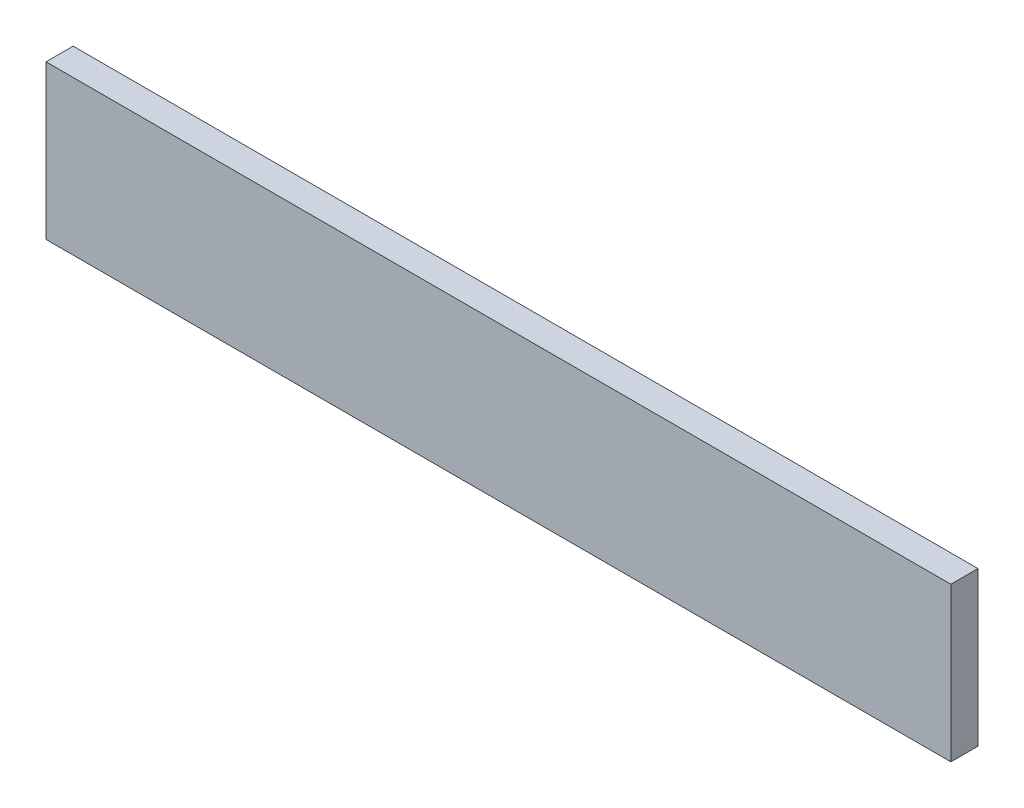
ISO-10303-21;
HEADER;
FILE_DESCRIPTION(('STEP AP214'),'2;1');
FILE_NAME('part.step','',(''),(''),'','','');
FILE_SCHEMA(('AUTOMOTIVE_DESIGN { 1 0 10303 214 1 1 1 1 }'));
ENDSEC;
DATA;
#1=APPLICATION_CONTEXT('core data for automotive mechanical design processes');
#2=APPLICATION_PROTOCOL_DEFINITION('international standard','automotive_design',2000,#1);
#3=PRODUCT_CONTEXT('',#1,'mechanical');
#4=PRODUCT('Part','Part','',(#3));
#5=PRODUCT_RELATED_PRODUCT_CATEGORY('part','',(#4));
#6=PRODUCT_DEFINITION_FORMATION('','',#4);
#7=PRODUCT_DEFINITION_CONTEXT('part definition',#1,'design');
#8=PRODUCT_DEFINITION('design','',#6,#7);
#9=PRODUCT_DEFINITION_SHAPE('','',#8);
#10=(LENGTH_UNIT() NAMED_UNIT(*) SI_UNIT(.MILLI.,.METRE.));
#11=(NAMED_UNIT(*) PLANE_ANGLE_UNIT() SI_UNIT($,.RADIAN.));
#12=(NAMED_UNIT(*) SI_UNIT($,.STERADIAN.) SOLID_ANGLE_UNIT());
#13=UNCERTAINTY_MEASURE_WITH_UNIT(LENGTH_MEASURE(1.E-05),#10,'distance_accuracy_value','');
#14=(GEOMETRIC_REPRESENTATION_CONTEXT(3) GLOBAL_UNCERTAINTY_ASSIGNED_CONTEXT((#13)) GLOBAL_UNIT_ASSIGNED_CONTEXT((#10,
#11,#12)) REPRESENTATION_CONTEXT('',''));
#15=CARTESIAN_POINT('',(0.,0.,0.));
#16=DIRECTION('',(0.,0.,1.));
#17=DIRECTION('',(1.,0.,0.));
#18=AXIS2_PLACEMENT_3D('',#15,#16,#17);
#19=CARTESIAN_POINT('',(50.,8.5,3.));
#20=DIRECTION('',(-1.,0.,0.));
#21=DIRECTION('',(0.,-1.,0.));
#22=AXIS2_PLACEMENT_3D('',#19,#20,#21);
#23=PLANE('',#22);
#24=DIRECTION('',(0.,1.,0.));
#25=VECTOR('',#24,1.);
#26=CARTESIAN_POINT('',(50.,8.5,0.));
#27=LINE('',#26,#25);
#28=CARTESIAN_POINT('',(50.,-8.5,0.));
#29=VERTEX_POINT('',#28);
#30=CARTESIAN_POINT('',(50.,8.5,0.));
#31=VERTEX_POINT('',#30);
#32=EDGE_CURVE('E96',#29,#31,#27,.T.);
#33=ORIENTED_EDGE('',*,*,#32,.T.);
#34=DIRECTION('',(0.,0.,-1.));
#35=VECTOR('',#34,1.);
#36=CARTESIAN_POINT('',(50.,8.5,3.));
#37=LINE('',#36,#35);
#38=CARTESIAN_POINT('',(50.,8.5,3.));
#39=VERTEX_POINT('',#38);
#40=EDGE_CURVE('E11',#39,#31,#37,.T.);
#41=ORIENTED_EDGE('',*,*,#40,.F.);
#42=DIRECTION('',(0.,1.,0.));
#43=VECTOR('',#42,1.);
#44=CARTESIAN_POINT('',(50.,8.5,3.));
#45=LINE('',#44,#43);
#46=CARTESIAN_POINT('',(50.,-8.5,3.));
#47=VERTEX_POINT('',#46);
#48=EDGE_CURVE('E84',#47,#39,#45,.T.);
#49=ORIENTED_EDGE('',*,*,#48,.F.);
#50=DIRECTION('',(0.,0.,-1.));
#51=VECTOR('',#50,1.);
#52=CARTESIAN_POINT('',(50.,-8.5,3.));
#53=LINE('',#52,#51);
#54=EDGE_CURVE('E92',#47,#29,#53,.T.);
#55=ORIENTED_EDGE('',*,*,#54,.T.);
#56=EDGE_LOOP('',(#33,#41,#49,#55));
#57=FACE_BOUND('',#56,.T.);
#58=ADVANCED_FACE('F33',(#57),#23,.F.);
#59=CARTESIAN_POINT('',(-50.,8.5,3.));
#60=DIRECTION('',(0.,-1.,0.));
#61=DIRECTION('',(0.,0.,-1.));
#62=AXIS2_PLACEMENT_3D('',#59,#60,#61);
#63=PLANE('',#62);
#64=DIRECTION('',(-1.,0.,0.));
#65=VECTOR('',#64,1.);
#66=CARTESIAN_POINT('',(-50.,8.5,0.));
#67=LINE('',#66,#65);
#68=CARTESIAN_POINT('',(-50.,8.5,0.));
#69=VERTEX_POINT('',#68);
#70=EDGE_CURVE('E88',#31,#69,#67,.T.);
#71=ORIENTED_EDGE('',*,*,#70,.T.);
#72=DIRECTION('',(0.,0.,-1.));
#73=VECTOR('',#72,1.);
#74=CARTESIAN_POINT('',(-50.,8.5,3.));
#75=LINE('',#74,#73);
#76=CARTESIAN_POINT('',(-50.,8.5,3.));
#77=VERTEX_POINT('',#76);
#78=EDGE_CURVE('E41',#77,#69,#75,.T.);
#79=ORIENTED_EDGE('',*,*,#78,.F.);
#80=DIRECTION('',(-1.,0.,0.));
#81=VECTOR('',#80,1.);
#82=CARTESIAN_POINT('',(-50.,8.5,3.));
#83=LINE('',#82,#81);
#84=EDGE_CURVE('E79',#39,#77,#83,.T.);
#85=ORIENTED_EDGE('',*,*,#84,.F.);
#86=ORIENTED_EDGE('',*,*,#40,.T.);
#87=EDGE_LOOP('',(#71,#79,#85,#86));
#88=FACE_BOUND('',#87,.T.);
#89=ADVANCED_FACE('F87',(#88),#63,.F.);
#90=CARTESIAN_POINT('',(-50.,8.5,3.));
#91=DIRECTION('',(1.,0.,0.));
#92=DIRECTION('',(0.,1.,0.));
#93=AXIS2_PLACEMENT_3D('',#90,#91,#92);
#94=PLANE('',#93);
#95=DIRECTION('',(0.,-1.,0.));
#96=VECTOR('',#95,1.);
#97=CARTESIAN_POINT('',(-50.,8.5,0.));
#98=LINE('',#97,#96);
#99=CARTESIAN_POINT('',(-50.,-8.5,0.));
#100=VERTEX_POINT('',#99);
#101=EDGE_CURVE('E66',#69,#100,#98,.T.);
#102=ORIENTED_EDGE('',*,*,#101,.T.);
#103=DIRECTION('',(0.,0.,-1.));
#104=VECTOR('',#103,1.);
#105=CARTESIAN_POINT('',(-50.,-8.5,3.));
#106=LINE('',#105,#104);
#107=CARTESIAN_POINT('',(-50.,-8.5,3.));
#108=VERTEX_POINT('',#107);
#109=EDGE_CURVE('E89',#108,#100,#106,.T.);
#110=ORIENTED_EDGE('',*,*,#109,.F.);
#111=DIRECTION('',(0.,-1.,0.));
#112=VECTOR('',#111,1.);
#113=CARTESIAN_POINT('',(-50.,8.5,3.));
#114=LINE('',#113,#112);
#115=EDGE_CURVE('E82',#77,#108,#114,.T.);
#116=ORIENTED_EDGE('',*,*,#115,.F.);
#117=ORIENTED_EDGE('',*,*,#78,.T.);
#118=EDGE_LOOP('',(#102,#110,#116,#117));
#119=FACE_BOUND('',#118,.T.);
#120=ADVANCED_FACE('F90',(#119),#94,.F.);
#121=CARTESIAN_POINT('',(-50.,-8.5,3.));
#122=DIRECTION('',(0.,1.,0.));
#123=DIRECTION('',(0.,0.,1.));
#124=AXIS2_PLACEMENT_3D('',#121,#122,#123);
#125=PLANE('',#124);
#126=DIRECTION('',(1.,0.,0.));
#127=VECTOR('',#126,1.);
#128=CARTESIAN_POINT('',(-50.,-8.5,0.));
#129=LINE('',#128,#127);
#130=EDGE_CURVE('E72',#100,#29,#129,.T.);
#131=ORIENTED_EDGE('',*,*,#130,.T.);
#132=ORIENTED_EDGE('',*,*,#54,.F.);
#133=DIRECTION('',(1.,0.,0.));
#134=VECTOR('',#133,1.);
#135=CARTESIAN_POINT('',(-50.,-8.5,3.));
#136=LINE('',#135,#134);
#137=EDGE_CURVE('E49',#108,#47,#136,.T.);
#138=ORIENTED_EDGE('',*,*,#137,.F.);
#139=ORIENTED_EDGE('',*,*,#109,.T.);
#140=EDGE_LOOP('',(#131,#132,#138,#139));
#141=FACE_BOUND('',#140,.T.);
#142=ADVANCED_FACE('F103',(#141),#125,.F.);
#143=CARTESIAN_POINT('',(0.,0.,3.));
#144=DIRECTION('',(0.,0.,1.));
#145=DIRECTION('',(1.,0.,0.));
#146=AXIS2_PLACEMENT_3D('',#143,#144,#145);
#147=PLANE('',#146);
#148=ORIENTED_EDGE('',*,*,#48,.T.);
#149=ORIENTED_EDGE('',*,*,#84,.T.);
#150=ORIENTED_EDGE('',*,*,#115,.T.);
#151=ORIENTED_EDGE('',*,*,#137,.T.);
#152=EDGE_LOOP('',(#148,#149,#150,#151));
#153=FACE_BOUND('',#152,.T.);
#154=ADVANCED_FACE('F80',(#153),#147,.T.);
#155=CARTESIAN_POINT('',(0.,0.,0.));
#156=DIRECTION('',(0.,0.,1.));
#157=DIRECTION('',(1.,0.,0.));
#158=AXIS2_PLACEMENT_3D('',#155,#156,#157);
#159=PLANE('',#158);
#160=ORIENTED_EDGE('',*,*,#32,.F.);
#161=ORIENTED_EDGE('',*,*,#130,.F.);
#162=ORIENTED_EDGE('',*,*,#101,.F.);
#163=ORIENTED_EDGE('',*,*,#70,.F.);
#164=EDGE_LOOP('',(#160,#161,#162,#163));
#165=FACE_BOUND('',#164,.T.);
#166=ADVANCED_FACE('F106',(#165),#159,.F.);
#167=CLOSED_SHELL('',(#58,#89,#120,#142,#154,#166));
#168=MANIFOLD_SOLID_BREP('B2',#167);
#169=ADVANCED_BREP_SHAPE_REPRESENTATION('',(#18,#168),#14);
#170=SHAPE_DEFINITION_REPRESENTATION(#9,#169);
ENDSEC;
END-ISO-10303-21;
